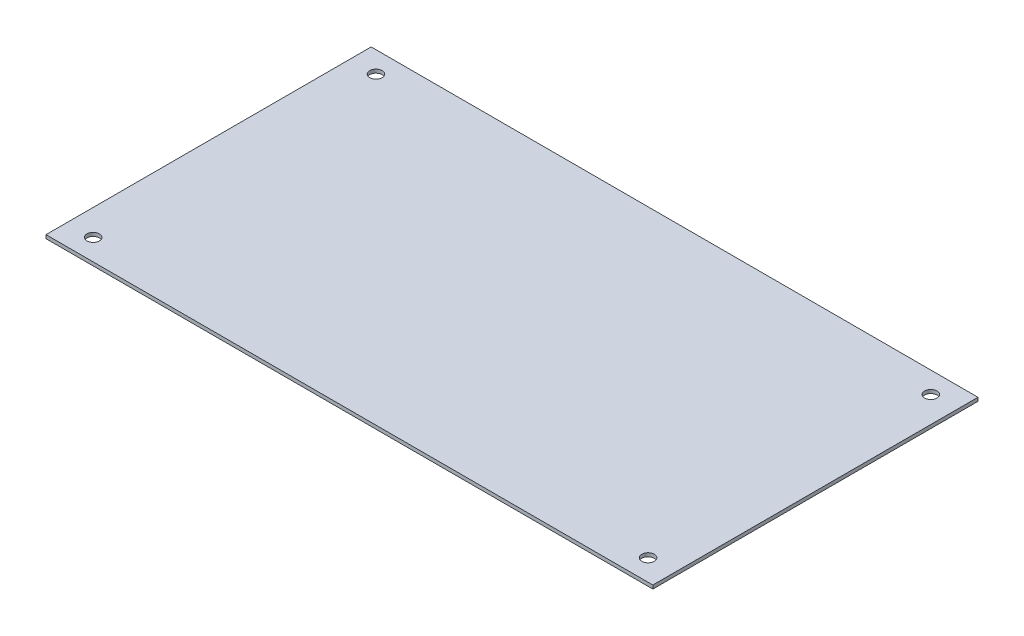
ISO-10303-21;
HEADER;
FILE_DESCRIPTION(('STEP AP214'),'2;1');
FILE_NAME('part.step','',(''),(''),'','','');
FILE_SCHEMA(('AUTOMOTIVE_DESIGN { 1 0 10303 214 1 1 1 1 }'));
ENDSEC;
DATA;
#1=APPLICATION_CONTEXT('core data for automotive mechanical design processes');
#2=APPLICATION_PROTOCOL_DEFINITION('international standard','automotive_design',2000,#1);
#3=PRODUCT_CONTEXT('',#1,'mechanical');
#4=PRODUCT('Part','Part','',(#3));
#5=PRODUCT_RELATED_PRODUCT_CATEGORY('part','',(#4));
#6=PRODUCT_DEFINITION_FORMATION('','',#4);
#7=PRODUCT_DEFINITION_CONTEXT('part definition',#1,'design');
#8=PRODUCT_DEFINITION('design','',#6,#7);
#9=PRODUCT_DEFINITION_SHAPE('','',#8);
#10=(LENGTH_UNIT() NAMED_UNIT(*) SI_UNIT(.MILLI.,.METRE.));
#11=(NAMED_UNIT(*) PLANE_ANGLE_UNIT() SI_UNIT($,.RADIAN.));
#12=(NAMED_UNIT(*) SI_UNIT($,.STERADIAN.) SOLID_ANGLE_UNIT());
#13=UNCERTAINTY_MEASURE_WITH_UNIT(LENGTH_MEASURE(1.E-05),#10,'distance_accuracy_value','');
#14=(GEOMETRIC_REPRESENTATION_CONTEXT(3) GLOBAL_UNCERTAINTY_ASSIGNED_CONTEXT((#13)) GLOBAL_UNIT_ASSIGNED_CONTEXT((#10,
#11,#12)) REPRESENTATION_CONTEXT('',''));
#15=CARTESIAN_POINT('',(0.,0.,0.));
#16=DIRECTION('',(0.,0.,1.));
#17=DIRECTION('',(1.,0.,0.));
#18=AXIS2_PLACEMENT_3D('',#15,#16,#17);
#19=CARTESIAN_POINT('',(0.,1.,0.));
#20=DIRECTION('',(0.,-1.,0.));
#21=DIRECTION('',(0.,0.,-1.));
#22=AXIS2_PLACEMENT_3D('',#19,#20,#21);
#23=PLANE('',#22);
#24=CARTESIAN_POINT('',(-78.4999999999992,1.,40.));
#25=DIRECTION('',(0.,1.,0.));
#26=DIRECTION('',(0.,0.,1.));
#27=AXIS2_PLACEMENT_3D('',#24,#25,#26);
#28=CIRCLE('',#27,1.75);
#29=CARTESIAN_POINT('',(-78.4999999999992,1.,41.75));
#30=VERTEX_POINT('',#29);
#31=EDGE_CURVE('E121',#30,#30,#28,.T.);
#32=ORIENTED_EDGE('',*,*,#31,.F.);
#33=EDGE_LOOP('',(#32));
#34=FACE_BOUND('',#33,.T.);
#35=CARTESIAN_POINT('',(-78.5,1.,-40.));
#36=DIRECTION('',(0.,1.,0.));
#37=DIRECTION('',(0.,0.,1.));
#38=AXIS2_PLACEMENT_3D('',#35,#36,#37);
#39=CIRCLE('',#38,1.75);
#40=CARTESIAN_POINT('',(-78.5,1.,-38.25));
#41=VERTEX_POINT('',#40);
#42=EDGE_CURVE('E100',#41,#41,#39,.T.);
#43=ORIENTED_EDGE('',*,*,#42,.F.);
#44=EDGE_LOOP('',(#43));
#45=FACE_BOUND('',#44,.T.);
#46=DIRECTION('',(0.,0.,-1.));
#47=VECTOR('',#46,1.);
#48=CARTESIAN_POINT('',(85.85,1.,46.));
#49=LINE('',#48,#47);
#50=CARTESIAN_POINT('',(85.85,1.,46.));
#51=VERTEX_POINT('',#50);
#52=CARTESIAN_POINT('',(85.85,1.,-46.));
#53=VERTEX_POINT('',#52);
#54=EDGE_CURVE('E85',#51,#53,#49,.T.);
#55=ORIENTED_EDGE('',*,*,#54,.T.);
#56=DIRECTION('',(-1.,0.,0.));
#57=VECTOR('',#56,1.);
#58=CARTESIAN_POINT('',(-85.85,1.,-46.));
#59=LINE('',#58,#57);
#60=CARTESIAN_POINT('',(-85.85,1.,-46.));
#61=VERTEX_POINT('',#60);
#62=EDGE_CURVE('E80',#53,#61,#59,.T.);
#63=ORIENTED_EDGE('',*,*,#62,.T.);
#64=DIRECTION('',(0.,0.,1.));
#65=VECTOR('',#64,1.);
#66=CARTESIAN_POINT('',(-85.85,1.,46.));
#67=LINE('',#66,#65);
#68=CARTESIAN_POINT('',(-85.85,1.,46.));
#69=VERTEX_POINT('',#68);
#70=EDGE_CURVE('E83',#61,#69,#67,.T.);
#71=ORIENTED_EDGE('',*,*,#70,.T.);
#72=DIRECTION('',(1.,0.,0.));
#73=VECTOR('',#72,1.);
#74=CARTESIAN_POINT('',(-85.85,1.,46.));
#75=LINE('',#74,#73);
#76=EDGE_CURVE('E50',#69,#51,#75,.T.);
#77=ORIENTED_EDGE('',*,*,#76,.T.);
#78=EDGE_LOOP('',(#55,#63,#71,#77));
#79=FACE_BOUND('',#78,.T.);
#80=CARTESIAN_POINT('',(78.5,1.,-40.));
#81=DIRECTION('',(0.,1.,0.));
#82=DIRECTION('',(0.,0.,1.));
#83=AXIS2_PLACEMENT_3D('',#80,#81,#82);
#84=CIRCLE('',#83,1.75);
#85=CARTESIAN_POINT('',(78.5,1.,-38.25));
#86=VERTEX_POINT('',#85);
#87=EDGE_CURVE('E115',#86,#86,#84,.T.);
#88=ORIENTED_EDGE('',*,*,#87,.F.);
#89=EDGE_LOOP('',(#88));
#90=FACE_BOUND('',#89,.T.);
#91=CARTESIAN_POINT('',(78.5000000000008,1.,40.));
#92=DIRECTION('',(0.,1.,0.));
#93=DIRECTION('',(0.,0.,1.));
#94=AXIS2_PLACEMENT_3D('',#91,#92,#93);
#95=CIRCLE('',#94,1.75);
#96=CARTESIAN_POINT('',(78.5000000000008,1.,41.75));
#97=VERTEX_POINT('',#96);
#98=EDGE_CURVE('E127',#97,#97,#95,.T.);
#99=ORIENTED_EDGE('',*,*,#98,.F.);
#100=EDGE_LOOP('',(#99));
#101=FACE_BOUND('',#100,.T.);
#102=ADVANCED_FACE('F33',(#34,#45,#79,#90,#101),#23,.F.);
#103=CARTESIAN_POINT('',(0.,0.,0.));
#104=DIRECTION('',(0.,-1.,0.));
#105=DIRECTION('',(0.,0.,-1.));
#106=AXIS2_PLACEMENT_3D('',#103,#104,#105);
#107=PLANE('',#106);
#108=CARTESIAN_POINT('',(-78.4999999999992,0.,40.));
#109=DIRECTION('',(0.,1.,0.));
#110=DIRECTION('',(0.,0.,1.));
#111=AXIS2_PLACEMENT_3D('',#108,#109,#110);
#112=CIRCLE('',#111,1.75);
#113=CARTESIAN_POINT('',(-78.4999999999992,0.,41.75));
#114=VERTEX_POINT('',#113);
#115=EDGE_CURVE('E124',#114,#114,#112,.T.);
#116=ORIENTED_EDGE('',*,*,#115,.T.);
#117=EDGE_LOOP('',(#116));
#118=FACE_BOUND('',#117,.T.);
#119=CARTESIAN_POINT('',(-78.5,0.,-40.));
#120=DIRECTION('',(0.,1.,0.));
#121=DIRECTION('',(0.,0.,1.));
#122=AXIS2_PLACEMENT_3D('',#119,#120,#121);
#123=CIRCLE('',#122,1.75);
#124=CARTESIAN_POINT('',(-78.5,0.,-38.25));
#125=VERTEX_POINT('',#124);
#126=EDGE_CURVE('E112',#125,#125,#123,.T.);
#127=ORIENTED_EDGE('',*,*,#126,.T.);
#128=EDGE_LOOP('',(#127));
#129=FACE_BOUND('',#128,.T.);
#130=DIRECTION('',(0.,0.,-1.));
#131=VECTOR('',#130,1.);
#132=CARTESIAN_POINT('',(85.85,0.,46.));
#133=LINE('',#132,#131);
#134=CARTESIAN_POINT('',(85.85,0.,46.));
#135=VERTEX_POINT('',#134);
#136=CARTESIAN_POINT('',(85.85,0.,-46.));
#137=VERTEX_POINT('',#136);
#138=EDGE_CURVE('E97',#135,#137,#133,.T.);
#139=ORIENTED_EDGE('',*,*,#138,.F.);
#140=DIRECTION('',(1.,0.,0.));
#141=VECTOR('',#140,1.);
#142=CARTESIAN_POINT('',(-85.85,0.,46.));
#143=LINE('',#142,#141);
#144=CARTESIAN_POINT('',(-85.85,0.,46.));
#145=VERTEX_POINT('',#144);
#146=EDGE_CURVE('E73',#145,#135,#143,.T.);
#147=ORIENTED_EDGE('',*,*,#146,.F.);
#148=DIRECTION('',(0.,0.,1.));
#149=VECTOR('',#148,1.);
#150=CARTESIAN_POINT('',(-85.85,0.,46.));
#151=LINE('',#150,#149);
#152=CARTESIAN_POINT('',(-85.85,0.,-46.));
#153=VERTEX_POINT('',#152);
#154=EDGE_CURVE('E67',#153,#145,#151,.T.);
#155=ORIENTED_EDGE('',*,*,#154,.F.);
#156=DIRECTION('',(-1.,0.,0.));
#157=VECTOR('',#156,1.);
#158=CARTESIAN_POINT('',(-85.85,0.,-46.));
#159=LINE('',#158,#157);
#160=EDGE_CURVE('E89',#137,#153,#159,.T.);
#161=ORIENTED_EDGE('',*,*,#160,.F.);
#162=EDGE_LOOP('',(#139,#147,#155,#161));
#163=FACE_BOUND('',#162,.T.);
#164=CARTESIAN_POINT('',(78.5,0.,-40.));
#165=DIRECTION('',(0.,1.,0.));
#166=DIRECTION('',(0.,0.,1.));
#167=AXIS2_PLACEMENT_3D('',#164,#165,#166);
#168=CIRCLE('',#167,1.75);
#169=CARTESIAN_POINT('',(78.5,0.,-38.25));
#170=VERTEX_POINT('',#169);
#171=EDGE_CURVE('E118',#170,#170,#168,.T.);
#172=ORIENTED_EDGE('',*,*,#171,.T.);
#173=EDGE_LOOP('',(#172));
#174=FACE_BOUND('',#173,.T.);
#175=CARTESIAN_POINT('',(78.5000000000008,0.,40.));
#176=DIRECTION('',(0.,1.,0.));
#177=DIRECTION('',(0.,0.,1.));
#178=AXIS2_PLACEMENT_3D('',#175,#176,#177);
#179=CIRCLE('',#178,1.75);
#180=CARTESIAN_POINT('',(78.5000000000008,0.,41.75));
#181=VERTEX_POINT('',#180);
#182=EDGE_CURVE('E130',#181,#181,#179,.T.);
#183=ORIENTED_EDGE('',*,*,#182,.T.);
#184=EDGE_LOOP('',(#183));
#185=FACE_BOUND('',#184,.T.);
#186=ADVANCED_FACE('F108',(#118,#129,#163,#174,#185),#107,.T.);
#187=CARTESIAN_POINT('',(85.85,1.,46.));
#188=DIRECTION('',(-1.,0.,0.));
#189=DIRECTION('',(0.,0.,1.));
#190=AXIS2_PLACEMENT_3D('',#187,#188,#189);
#191=PLANE('',#190);
#192=ORIENTED_EDGE('',*,*,#138,.T.);
#193=DIRECTION('',(0.,-1.,0.));
#194=VECTOR('',#193,1.);
#195=CARTESIAN_POINT('',(85.85,1.,-46.));
#196=LINE('',#195,#194);
#197=EDGE_CURVE('E11',#53,#137,#196,.T.);
#198=ORIENTED_EDGE('',*,*,#197,.F.);
#199=ORIENTED_EDGE('',*,*,#54,.F.);
#200=DIRECTION('',(0.,-1.,0.));
#201=VECTOR('',#200,1.);
#202=CARTESIAN_POINT('',(85.85,1.,46.));
#203=LINE('',#202,#201);
#204=EDGE_CURVE('E93',#51,#135,#203,.T.);
#205=ORIENTED_EDGE('',*,*,#204,.T.);
#206=EDGE_LOOP('',(#192,#198,#199,#205));
#207=FACE_BOUND('',#206,.T.);
#208=ADVANCED_FACE('F35',(#207),#191,.F.);
#209=CARTESIAN_POINT('',(-85.85,1.,-46.));
#210=DIRECTION('',(0.,0.,1.));
#211=DIRECTION('',(1.,0.,0.));
#212=AXIS2_PLACEMENT_3D('',#209,#210,#211);
#213=PLANE('',#212);
#214=ORIENTED_EDGE('',*,*,#160,.T.);
#215=DIRECTION('',(0.,-1.,0.));
#216=VECTOR('',#215,1.);
#217=CARTESIAN_POINT('',(-85.85,1.,-46.));
#218=LINE('',#217,#216);
#219=EDGE_CURVE('E42',#61,#153,#218,.T.);
#220=ORIENTED_EDGE('',*,*,#219,.F.);
#221=ORIENTED_EDGE('',*,*,#62,.F.);
#222=ORIENTED_EDGE('',*,*,#197,.T.);
#223=EDGE_LOOP('',(#214,#220,#221,#222));
#224=FACE_BOUND('',#223,.T.);
#225=ADVANCED_FACE('F88',(#224),#213,.F.);
#226=CARTESIAN_POINT('',(-85.85,1.,46.));
#227=DIRECTION('',(1.,0.,0.));
#228=DIRECTION('',(0.,0.,-1.));
#229=AXIS2_PLACEMENT_3D('',#226,#227,#228);
#230=PLANE('',#229);
#231=ORIENTED_EDGE('',*,*,#154,.T.);
#232=DIRECTION('',(0.,-1.,0.));
#233=VECTOR('',#232,1.);
#234=CARTESIAN_POINT('',(-85.85,1.,46.));
#235=LINE('',#234,#233);
#236=EDGE_CURVE('E90',#69,#145,#235,.T.);
#237=ORIENTED_EDGE('',*,*,#236,.F.);
#238=ORIENTED_EDGE('',*,*,#70,.F.);
#239=ORIENTED_EDGE('',*,*,#219,.T.);
#240=EDGE_LOOP('',(#231,#237,#238,#239));
#241=FACE_BOUND('',#240,.T.);
#242=ADVANCED_FACE('F91',(#241),#230,.F.);
#243=CARTESIAN_POINT('',(-85.85,1.,46.));
#244=DIRECTION('',(0.,0.,-1.));
#245=DIRECTION('',(-1.,0.,0.));
#246=AXIS2_PLACEMENT_3D('',#243,#244,#245);
#247=PLANE('',#246);
#248=ORIENTED_EDGE('',*,*,#146,.T.);
#249=ORIENTED_EDGE('',*,*,#204,.F.);
#250=ORIENTED_EDGE('',*,*,#76,.F.);
#251=ORIENTED_EDGE('',*,*,#236,.T.);
#252=EDGE_LOOP('',(#248,#249,#250,#251));
#253=FACE_BOUND('',#252,.T.);
#254=ADVANCED_FACE('F105',(#253),#247,.F.);
#255=CARTESIAN_POINT('',(-78.5,1.,-40.));
#256=DIRECTION('',(0.,-1.,0.));
#257=DIRECTION('',(0.,0.,-1.));
#258=AXIS2_PLACEMENT_3D('',#255,#256,#257);
#259=CYLINDRICAL_SURFACE('',#258,1.75);
#260=ORIENTED_EDGE('',*,*,#42,.T.);
#261=EDGE_LOOP('',(#260));
#262=FACE_BOUND('',#261,.T.);
#263=ORIENTED_EDGE('',*,*,#126,.F.);
#264=EDGE_LOOP('',(#263));
#265=FACE_BOUND('',#264,.T.);
#266=ADVANCED_FACE('F150',(#262,#265),#259,.F.);
#267=CARTESIAN_POINT('',(78.5,1.,-40.));
#268=DIRECTION('',(0.,-1.,0.));
#269=DIRECTION('',(0.,0.,-1.));
#270=AXIS2_PLACEMENT_3D('',#267,#268,#269);
#271=CYLINDRICAL_SURFACE('',#270,1.75);
#272=ORIENTED_EDGE('',*,*,#87,.T.);
#273=EDGE_LOOP('',(#272));
#274=FACE_BOUND('',#273,.T.);
#275=ORIENTED_EDGE('',*,*,#171,.F.);
#276=EDGE_LOOP('',(#275));
#277=FACE_BOUND('',#276,.T.);
#278=ADVANCED_FACE('F196',(#274,#277),#271,.F.);
#279=CARTESIAN_POINT('',(-78.4999999999992,1.,40.));
#280=DIRECTION('',(0.,-1.,0.));
#281=DIRECTION('',(0.,0.,-1.));
#282=AXIS2_PLACEMENT_3D('',#279,#280,#281);
#283=CYLINDRICAL_SURFACE('',#282,1.75);
#284=ORIENTED_EDGE('',*,*,#31,.T.);
#285=EDGE_LOOP('',(#284));
#286=FACE_BOUND('',#285,.T.);
#287=ORIENTED_EDGE('',*,*,#115,.F.);
#288=EDGE_LOOP('',(#287));
#289=FACE_BOUND('',#288,.T.);
#290=ADVANCED_FACE('F204',(#286,#289),#283,.F.);
#291=CARTESIAN_POINT('',(78.5000000000008,1.,40.));
#292=DIRECTION('',(0.,-1.,0.));
#293=DIRECTION('',(0.,0.,-1.));
#294=AXIS2_PLACEMENT_3D('',#291,#292,#293);
#295=CYLINDRICAL_SURFACE('',#294,1.75);
#296=ORIENTED_EDGE('',*,*,#98,.T.);
#297=EDGE_LOOP('',(#296));
#298=FACE_BOUND('',#297,.T.);
#299=ORIENTED_EDGE('',*,*,#182,.F.);
#300=EDGE_LOOP('',(#299));
#301=FACE_BOUND('',#300,.T.);
#302=ADVANCED_FACE('F136',(#298,#301),#295,.F.);
#303=CLOSED_SHELL('',(#102,#186,#208,#225,#242,#254,#266,#278,#290,#302));
#304=MANIFOLD_SOLID_BREP('B2',#303);
#305=ADVANCED_BREP_SHAPE_REPRESENTATION('',(#18,#304),#14);
#306=SHAPE_DEFINITION_REPRESENTATION(#9,#305);
ENDSEC;
END-ISO-10303-21;
